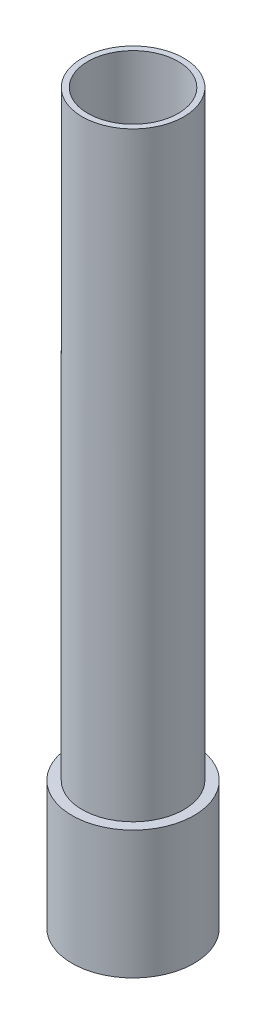
ISO-10303-21;
HEADER;
FILE_DESCRIPTION(('STEP AP214'),'2;1');
FILE_NAME('part.step','',(''),(''),'','','');
FILE_SCHEMA(('AUTOMOTIVE_DESIGN { 1 0 10303 214 1 1 1 1 }'));
ENDSEC;
DATA;
#1=APPLICATION_CONTEXT('core data for automotive mechanical design processes');
#2=APPLICATION_PROTOCOL_DEFINITION('international standard','automotive_design',2000,#1);
#3=PRODUCT_CONTEXT('',#1,'mechanical');
#4=PRODUCT('Part','Part','',(#3));
#5=PRODUCT_RELATED_PRODUCT_CATEGORY('part','',(#4));
#6=PRODUCT_DEFINITION_FORMATION('','',#4);
#7=PRODUCT_DEFINITION_CONTEXT('part definition',#1,'design');
#8=PRODUCT_DEFINITION('design','',#6,#7);
#9=PRODUCT_DEFINITION_SHAPE('','',#8);
#10=(LENGTH_UNIT() NAMED_UNIT(*) SI_UNIT(.MILLI.,.METRE.));
#11=(NAMED_UNIT(*) PLANE_ANGLE_UNIT() SI_UNIT($,.RADIAN.));
#12=(NAMED_UNIT(*) SI_UNIT($,.STERADIAN.) SOLID_ANGLE_UNIT());
#13=UNCERTAINTY_MEASURE_WITH_UNIT(LENGTH_MEASURE(1.E-05),#10,'distance_accuracy_value','');
#14=(GEOMETRIC_REPRESENTATION_CONTEXT(3) GLOBAL_UNCERTAINTY_ASSIGNED_CONTEXT((#13)) GLOBAL_UNIT_ASSIGNED_CONTEXT((#10,
#11,#12)) REPRESENTATION_CONTEXT('',''));
#15=CARTESIAN_POINT('',(0.,0.,0.));
#16=DIRECTION('',(0.,0.,1.));
#17=DIRECTION('',(1.,0.,0.));
#18=AXIS2_PLACEMENT_3D('',#15,#16,#17);
#19=CARTESIAN_POINT('',(13.6326591615901,113.72,-6.07942908557396));
#20=DIRECTION('',(0.,-1.,0.));
#21=DIRECTION('',(0.,0.,-1.));
#22=AXIS2_PLACEMENT_3D('',#19,#20,#21);
#23=CYLINDRICAL_SURFACE('',#22,7.9375);
#24=CARTESIAN_POINT('',(13.6326591615901,113.72,-6.07942908557396));
#25=DIRECTION('',(0.,1.,0.));
#26=DIRECTION('',(0.,0.,1.));
#27=AXIS2_PLACEMENT_3D('',#24,#25,#26);
#28=CIRCLE('',#27,7.9375);
#29=CARTESIAN_POINT('',(13.6326591615901,113.72,1.85807091442604));
#30=VERTEX_POINT('',#29);
#31=EDGE_CURVE('E39',#30,#30,#28,.T.);
#32=ORIENTED_EDGE('',*,*,#31,.F.);
#33=EDGE_LOOP('',(#32));
#34=FACE_BOUND('',#33,.T.);
#35=CARTESIAN_POINT('',(13.6326591615901,20.,-6.07942908557396));
#36=DIRECTION('',(0.,-1.,0.));
#37=DIRECTION('',(0.,0.,-1.));
#38=AXIS2_PLACEMENT_3D('',#35,#36,#37);
#39=CIRCLE('',#38,7.9375);
#40=CARTESIAN_POINT('',(13.6326591615901,20.,-14.016929085574));
#41=VERTEX_POINT('',#40);
#42=EDGE_CURVE('E10',#41,#41,#39,.T.);
#43=ORIENTED_EDGE('',*,*,#42,.F.);
#44=EDGE_LOOP('',(#43));
#45=FACE_BOUND('',#44,.T.);
#46=ADVANCED_FACE('F33',(#34,#45),#23,.T.);
#47=CARTESIAN_POINT('',(13.6326591615901,113.72,-6.07942908557396));
#48=DIRECTION('',(0.,1.,0.));
#49=DIRECTION('',(0.,0.,1.));
#50=AXIS2_PLACEMENT_3D('',#47,#48,#49);
#51=PLANE('',#50);
#52=ORIENTED_EDGE('',*,*,#31,.T.);
#53=EDGE_LOOP('',(#52));
#54=FACE_BOUND('',#53,.T.);
#55=CARTESIAN_POINT('',(13.6326591615901,113.72,-6.07942908557396));
#56=DIRECTION('',(0.,1.,0.));
#57=DIRECTION('',(0.,0.,1.));
#58=AXIS2_PLACEMENT_3D('',#55,#56,#57);
#59=CIRCLE('',#58,7.0485);
#60=CARTESIAN_POINT('',(13.6326591615901,113.72,0.969070914426036));
#61=VERTEX_POINT('',#60);
#62=EDGE_CURVE('E43',#61,#61,#59,.T.);
#63=ORIENTED_EDGE('',*,*,#62,.F.);
#64=EDGE_LOOP('',(#63));
#65=FACE_BOUND('',#64,.T.);
#66=ADVANCED_FACE('F71',(#54,#65),#51,.T.);
#67=CARTESIAN_POINT('',(13.6326591615901,0.,-6.07942908557396));
#68=DIRECTION('',(0.,1.,0.));
#69=DIRECTION('',(0.,0.,1.));
#70=AXIS2_PLACEMENT_3D('',#67,#68,#69);
#71=PLANE('',#70);
#72=CARTESIAN_POINT('',(13.6326591615901,0.,-6.07942908557396));
#73=DIRECTION('',(0.,1.,0.));
#74=DIRECTION('',(0.,0.,1.));
#75=AXIS2_PLACEMENT_3D('',#72,#73,#74);
#76=CIRCLE('',#75,7.0485);
#77=CARTESIAN_POINT('',(13.6326591615901,0.,0.969070914426036));
#78=VERTEX_POINT('',#77);
#79=EDGE_CURVE('E47',#78,#78,#76,.T.);
#80=ORIENTED_EDGE('',*,*,#79,.T.);
#81=EDGE_LOOP('',(#80));
#82=FACE_BOUND('',#81,.T.);
#83=CARTESIAN_POINT('',(13.6326591615901,0.,-6.07942908557396));
#84=DIRECTION('',(0.,-1.,0.));
#85=DIRECTION('',(0.,0.,-1.));
#86=AXIS2_PLACEMENT_3D('',#83,#84,#85);
#87=CIRCLE('',#86,9.525);
#88=CARTESIAN_POINT('',(13.6326591615901,0.,-15.604429085574));
#89=VERTEX_POINT('',#88);
#90=EDGE_CURVE('E53',#89,#89,#87,.T.);
#91=ORIENTED_EDGE('',*,*,#90,.T.);
#92=EDGE_LOOP('',(#91));
#93=FACE_BOUND('',#92,.T.);
#94=ADVANCED_FACE('F76',(#82,#93),#71,.F.);
#95=CARTESIAN_POINT('',(13.6326591615901,113.72,-6.07942908557396));
#96=DIRECTION('',(0.,-1.,0.));
#97=DIRECTION('',(0.,0.,-1.));
#98=AXIS2_PLACEMENT_3D('',#95,#96,#97);
#99=CYLINDRICAL_SURFACE('',#98,7.0485);
#100=ORIENTED_EDGE('',*,*,#62,.T.);
#101=EDGE_LOOP('',(#100));
#102=FACE_BOUND('',#101,.T.);
#103=ORIENTED_EDGE('',*,*,#79,.F.);
#104=EDGE_LOOP('',(#103));
#105=FACE_BOUND('',#104,.T.);
#106=ADVANCED_FACE('F68',(#102,#105),#99,.F.);
#107=CARTESIAN_POINT('',(13.6326591615901,20.,-6.07942908557396));
#108=DIRECTION('',(0.,-1.,0.));
#109=DIRECTION('',(0.,0.,-1.));
#110=AXIS2_PLACEMENT_3D('',#107,#108,#109);
#111=CYLINDRICAL_SURFACE('',#110,9.525);
#112=CARTESIAN_POINT('',(13.6326591615901,20.,-6.07942908557396));
#113=DIRECTION('',(0.,-1.,0.));
#114=DIRECTION('',(0.,0.,-1.));
#115=AXIS2_PLACEMENT_3D('',#112,#113,#114);
#116=CIRCLE('',#115,9.525);
#117=CARTESIAN_POINT('',(13.6326591615901,20.,-15.604429085574));
#118=VERTEX_POINT('',#117);
#119=EDGE_CURVE('E51',#118,#118,#116,.T.);
#120=ORIENTED_EDGE('',*,*,#119,.T.);
#121=EDGE_LOOP('',(#120));
#122=FACE_BOUND('',#121,.T.);
#123=ORIENTED_EDGE('',*,*,#90,.F.);
#124=EDGE_LOOP('',(#123));
#125=FACE_BOUND('',#124,.T.);
#126=ADVANCED_FACE('F59',(#122,#125),#111,.T.);
#127=CARTESIAN_POINT('',(13.6326591615901,20.,-6.07942908557396));
#128=DIRECTION('',(0.,-1.,0.));
#129=DIRECTION('',(0.,0.,-1.));
#130=AXIS2_PLACEMENT_3D('',#127,#128,#129);
#131=PLANE('',#130);
#132=ORIENTED_EDGE('',*,*,#42,.T.);
#133=EDGE_LOOP('',(#132));
#134=FACE_BOUND('',#133,.T.);
#135=ORIENTED_EDGE('',*,*,#119,.F.);
#136=EDGE_LOOP('',(#135));
#137=FACE_BOUND('',#136,.T.);
#138=ADVANCED_FACE('F62',(#134,#137),#131,.F.);
#139=CLOSED_SHELL('',(#46,#66,#94,#106,#126,#138));
#140=MANIFOLD_SOLID_BREP('B2',#139);
#141=ADVANCED_BREP_SHAPE_REPRESENTATION('',(#18,#140),#14);
#142=SHAPE_DEFINITION_REPRESENTATION(#9,#141);
ENDSEC;
END-ISO-10303-21;
